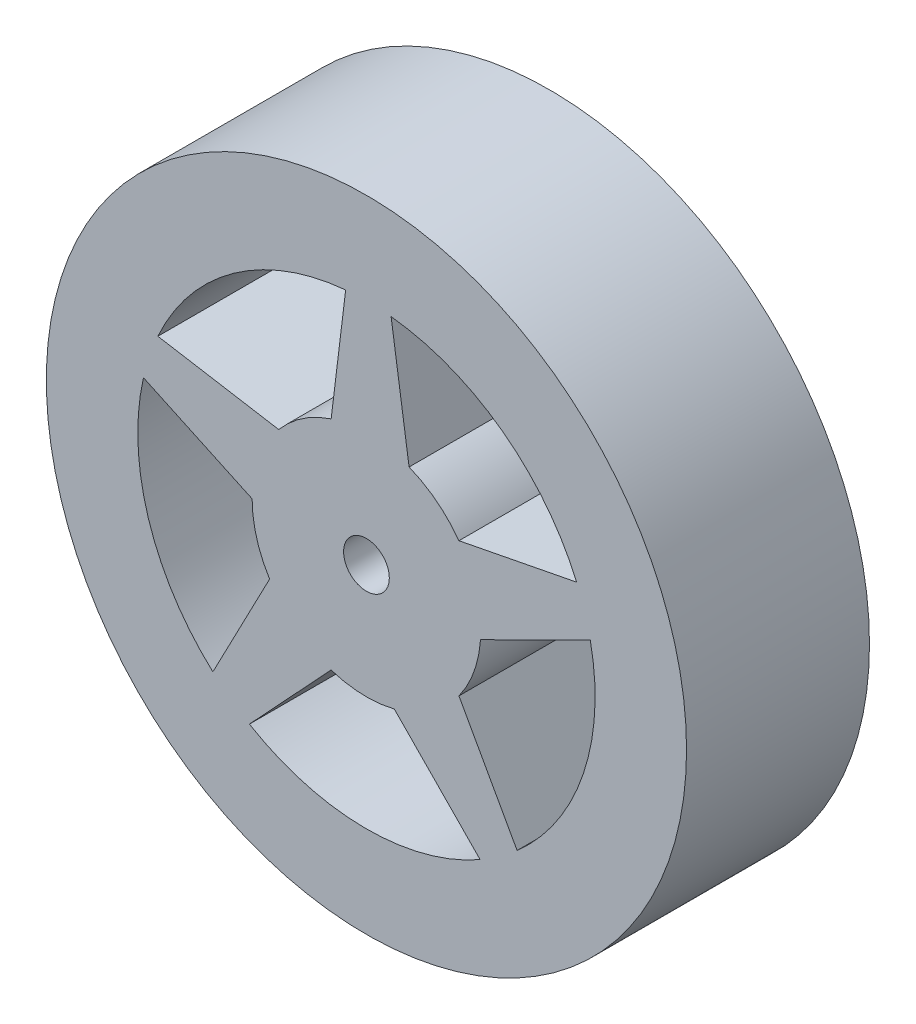
ISO-10303-21;
HEADER;
FILE_DESCRIPTION(('STEP AP214'),'2;1');
FILE_NAME('part.step','',(''),(''),'','','');
FILE_SCHEMA(('AUTOMOTIVE_DESIGN { 1 0 10303 214 1 1 1 1 }'));
ENDSEC;
DATA;
#1=APPLICATION_CONTEXT('core data for automotive mechanical design processes');
#2=APPLICATION_PROTOCOL_DEFINITION('international standard','automotive_design',2000,#1);
#3=PRODUCT_CONTEXT('',#1,'mechanical');
#4=PRODUCT('Part','Part','',(#3));
#5=PRODUCT_RELATED_PRODUCT_CATEGORY('part','',(#4));
#6=PRODUCT_DEFINITION_FORMATION('','',#4);
#7=PRODUCT_DEFINITION_CONTEXT('part definition',#1,'design');
#8=PRODUCT_DEFINITION('design','',#6,#7);
#9=PRODUCT_DEFINITION_SHAPE('','',#8);
#10=(LENGTH_UNIT() NAMED_UNIT(*) SI_UNIT(.MILLI.,.METRE.));
#11=(NAMED_UNIT(*) PLANE_ANGLE_UNIT() SI_UNIT($,.RADIAN.));
#12=(NAMED_UNIT(*) SI_UNIT($,.STERADIAN.) SOLID_ANGLE_UNIT());
#13=UNCERTAINTY_MEASURE_WITH_UNIT(LENGTH_MEASURE(1.E-05),#10,'distance_accuracy_value','');
#14=(GEOMETRIC_REPRESENTATION_CONTEXT(3) GLOBAL_UNCERTAINTY_ASSIGNED_CONTEXT((#13)) GLOBAL_UNIT_ASSIGNED_CONTEXT((#10,
#11,#12)) REPRESENTATION_CONTEXT('',''));
#15=CARTESIAN_POINT('',(0.,0.,0.));
#16=DIRECTION('',(0.,0.,1.));
#17=DIRECTION('',(1.,0.,0.));
#18=AXIS2_PLACEMENT_3D('',#15,#16,#17);
#19=CARTESIAN_POINT('',(0.,0.,-10.));
#20=DIRECTION('',(0.,0.,1.));
#21=DIRECTION('',(1.,0.,0.));
#22=AXIS2_PLACEMENT_3D('',#19,#20,#21);
#23=CYLINDRICAL_SURFACE('',#22,2.5);
#24=CARTESIAN_POINT('',(0.,0.,10.));
#25=DIRECTION('',(0.,0.,1.));
#26=DIRECTION('',(1.,0.,0.));
#27=AXIS2_PLACEMENT_3D('',#24,#25,#26);
#28=CIRCLE('',#27,2.5);
#29=CARTESIAN_POINT('',(2.5,0.,10.));
#30=VERTEX_POINT('',#29);
#31=EDGE_CURVE('E292',#30,#30,#28,.T.);
#32=ORIENTED_EDGE('',*,*,#31,.T.);
#33=EDGE_LOOP('',(#32));
#34=FACE_BOUND('',#33,.T.);
#35=CARTESIAN_POINT('',(0.,0.,0.));
#36=DIRECTION('',(0.,0.,-1.));
#37=DIRECTION('',(-1.,0.,0.));
#38=AXIS2_PLACEMENT_3D('',#35,#36,#37);
#39=CIRCLE('',#38,2.5);
#40=CARTESIAN_POINT('',(-2.5,0.,0.));
#41=VERTEX_POINT('',#40);
#42=EDGE_CURVE('E47',#41,#41,#39,.F.);
#43=ORIENTED_EDGE('',*,*,#42,.F.);
#44=EDGE_LOOP('',(#43));
#45=FACE_BOUND('',#44,.T.);
#46=ADVANCED_FACE('F43',(#34,#45),#23,.F.);
#47=CARTESIAN_POINT('',(0.,0.,10.));
#48=DIRECTION('',(0.,0.,-1.));
#49=DIRECTION('',(-1.,0.,0.));
#50=AXIS2_PLACEMENT_3D('',#47,#48,#49);
#51=CYLINDRICAL_SURFACE('',#50,25.);
#52=DIRECTION('',(0.,0.,-1.));
#53=VECTOR('',#52,1.);
#54=CARTESIAN_POINT('',(24.4708623778841,5.11633604082602,10.));
#55=LINE('',#54,#53);
#56=CARTESIAN_POINT('',(24.4708623778841,5.11633604082602,-10.));
#57=VERTEX_POINT('',#56);
#58=CARTESIAN_POINT('',(24.4708623778841,5.11633604082602,10.));
#59=VERTEX_POINT('',#58);
#60=EDGE_CURVE('E410',#57,#59,#55,.F.);
#61=ORIENTED_EDGE('',*,*,#60,.F.);
#62=CARTESIAN_POINT('',(0.,0.,-10.));
#63=DIRECTION('',(0.,0.,1.));
#64=DIRECTION('',(1.,0.,0.));
#65=AXIS2_PLACEMENT_3D('',#62,#63,#64);
#66=CIRCLE('',#65,25.);
#67=CARTESIAN_POINT('',(16.4712049980899,-18.8068978279486,-10.));
#68=VERTEX_POINT('',#67);
#69=EDGE_CURVE('E635',#68,#57,#66,.T.);
#70=ORIENTED_EDGE('',*,*,#69,.F.);
#71=DIRECTION('',(0.,0.,-1.));
#72=VECTOR('',#71,1.);
#73=CARTESIAN_POINT('',(16.4712049980899,-18.8068978279486,10.));
#74=LINE('',#73,#72);
#75=CARTESIAN_POINT('',(16.4712049980899,-18.8068978279486,10.));
#76=VERTEX_POINT('',#75);
#77=EDGE_CURVE('E68',#76,#68,#74,.T.);
#78=ORIENTED_EDGE('',*,*,#77,.F.);
#79=CARTESIAN_POINT('',(0.,0.,10.));
#80=DIRECTION('',(0.,0.,1.));
#81=DIRECTION('',(1.,0.,0.));
#82=AXIS2_PLACEMENT_3D('',#79,#80,#81);
#83=CIRCLE('',#82,25.);
#84=EDGE_CURVE('E641',#76,#59,#83,.T.);
#85=ORIENTED_EDGE('',*,*,#84,.T.);
#86=EDGE_LOOP('',(#61,#70,#78,#85));
#87=FACE_BOUND('',#86,.T.);
#88=ADVANCED_FACE('F519',(#87),#51,.F.);
#89=DIRECTION('',(0.,0.,-1.));
#90=VECTOR('',#89,1.);
#91=CARTESIAN_POINT('',(-12.7965404683244,-21.4766978849761,10.));
#92=LINE('',#91,#90);
#93=CARTESIAN_POINT('',(-12.7965404683244,-21.4766978849761,10.));
#94=VERTEX_POINT('',#93);
#95=CARTESIAN_POINT('',(-12.7965404683244,-21.4766978849761,-10.));
#96=VERTEX_POINT('',#95);
#97=EDGE_CURVE('E402',#94,#96,#92,.T.);
#98=ORIENTED_EDGE('',*,*,#97,.F.);
#99=CARTESIAN_POINT('',(12.42783707296,-21.6921383383004,10.));
#100=VERTEX_POINT('',#99);
#101=EDGE_CURVE('E498',#94,#100,#83,.T.);
#102=ORIENTED_EDGE('',*,*,#101,.T.);
#103=DIRECTION('',(0.,0.,-1.));
#104=VECTOR('',#103,1.);
#105=CARTESIAN_POINT('',(12.42783707296,-21.6921383383004,10.));
#106=LINE('',#105,#104);
#107=CARTESIAN_POINT('',(12.42783707296,-21.6921383383004,-10.));
#108=VERTEX_POINT('',#107);
#109=EDGE_CURVE('E386',#108,#100,#106,.F.);
#110=ORIENTED_EDGE('',*,*,#109,.F.);
#111=EDGE_CURVE('E595',#96,#108,#66,.T.);
#112=ORIENTED_EDGE('',*,*,#111,.F.);
#113=EDGE_LOOP('',(#98,#102,#110,#112));
#114=FACE_BOUND('',#113,.T.);
#115=ADVANCED_FACE('F525',(#114),#51,.F.);
#116=DIRECTION('',(0.,0.,-1.));
#117=VECTOR('',#116,1.);
#118=CARTESIAN_POINT('',(-16.7900366601489,-18.5228148225602,10.));
#119=LINE('',#118,#117);
#120=CARTESIAN_POINT('',(-16.7900366601489,-18.5228148225602,-10.));
#121=VERTEX_POINT('',#120);
#122=CARTESIAN_POINT('',(-16.7900366601489,-18.5228148225602,10.));
#123=VERTEX_POINT('',#122);
#124=EDGE_CURVE('E398',#121,#123,#119,.F.);
#125=ORIENTED_EDGE('',*,*,#124,.F.);
#126=CARTESIAN_POINT('',(-24.3799019459278,5.53356856892053,-10.));
#127=VERTEX_POINT('',#126);
#128=EDGE_CURVE('E457',#127,#121,#66,.T.);
#129=ORIENTED_EDGE('',*,*,#128,.F.);
#130=DIRECTION('',(0.,0.,-1.));
#131=VECTOR('',#130,1.);
#132=CARTESIAN_POINT('',(-24.3799019459278,5.53356856892053,10.));
#133=LINE('',#132,#131);
#134=CARTESIAN_POINT('',(-24.3799019459278,5.53356856892053,10.));
#135=VERTEX_POINT('',#134);
#136=EDGE_CURVE('E394',#135,#127,#133,.T.);
#137=ORIENTED_EDGE('',*,*,#136,.F.);
#138=EDGE_CURVE('E451',#135,#123,#83,.T.);
#139=ORIENTED_EDGE('',*,*,#138,.T.);
#140=EDGE_LOOP('',(#125,#129,#137,#139));
#141=FACE_BOUND('',#140,.T.);
#142=ADVANCED_FACE('F577',(#141),#51,.F.);
#143=DIRECTION('',(0.,0.,-1.));
#144=VECTOR('',#143,1.);
#145=CARTESIAN_POINT('',(-22.8046504012887,10.2444092106379,10.));
#146=LINE('',#145,#144);
#147=CARTESIAN_POINT('',(-22.8046504012887,10.2444092106379,-10.));
#148=VERTEX_POINT('',#147);
#149=CARTESIAN_POINT('',(-22.8046504012887,10.2444092106379,10.));
#150=VERTEX_POINT('',#149);
#151=EDGE_CURVE('E390',#148,#150,#146,.F.);
#152=ORIENTED_EDGE('',*,*,#151,.F.);
#153=CARTESIAN_POINT('',(-2.27106757664891,24.896631339647,-10.));
#154=VERTEX_POINT('',#153);
#155=EDGE_CURVE('E453',#154,#148,#66,.T.);
#156=ORIENTED_EDGE('',*,*,#155,.F.);
#157=DIRECTION('',(0.,0.,-1.));
#158=VECTOR('',#157,1.);
#159=CARTESIAN_POINT('',(-2.27106757664891,24.896631339647,10.));
#160=LINE('',#159,#158);
#161=CARTESIAN_POINT('',(-2.27106757664891,24.896631339647,10.));
#162=VERTEX_POINT('',#161);
#163=EDGE_CURVE('E53',#162,#154,#160,.T.);
#164=ORIENTED_EDGE('',*,*,#163,.F.);
#165=EDGE_CURVE('E447',#162,#150,#83,.T.);
#166=ORIENTED_EDGE('',*,*,#165,.T.);
#167=EDGE_LOOP('',(#152,#156,#164,#166));
#168=FACE_BOUND('',#167,.T.);
#169=ADVANCED_FACE('F475',(#168),#51,.F.);
#170=CARTESIAN_POINT('',(0.,0.,10.));
#171=DIRECTION('',(0.,0.,-1.));
#172=DIRECTION('',(-1.,0.,0.));
#173=AXIS2_PLACEMENT_3D('',#170,#171,#172);
#174=CYLINDRICAL_SURFACE('',#173,12.5);
#175=CARTESIAN_POINT('',(0.,0.,-10.));
#176=DIRECTION('',(0.,0.,1.));
#177=DIRECTION('',(1.,0.,0.));
#178=AXIS2_PLACEMENT_3D('',#175,#176,#177);
#179=CIRCLE('',#178,12.5);
#180=CARTESIAN_POINT('',(10.1106359392021,-7.35017284864209,-10.));
#181=VERTEX_POINT('',#180);
#182=CARTESIAN_POINT('',(12.4710442423428,-0.850326705171322,-10.));
#183=VERTEX_POINT('',#182);
#184=EDGE_CURVE('E606',#181,#183,#179,.T.);
#185=ORIENTED_EDGE('',*,*,#184,.T.);
#186=DIRECTION('',(0.,0.,-1.));
#187=VECTOR('',#186,1.);
#188=CARTESIAN_POINT('',(12.4710442423428,-0.85032670517132,10.));
#189=LINE('',#188,#187);
#190=CARTESIAN_POINT('',(12.4710442423428,-0.850326705171322,10.));
#191=VERTEX_POINT('',#190);
#192=EDGE_CURVE('E380',#191,#183,#189,.T.);
#193=ORIENTED_EDGE('',*,*,#192,.F.);
#194=CARTESIAN_POINT('',(0.,0.,10.));
#195=DIRECTION('',(0.,0.,1.));
#196=DIRECTION('',(1.,0.,0.));
#197=AXIS2_PLACEMENT_3D('',#194,#195,#196);
#198=CIRCLE('',#197,12.5);
#199=CARTESIAN_POINT('',(10.1106359392021,-7.35017284864209,10.));
#200=VERTEX_POINT('',#199);
#201=EDGE_CURVE('E624',#200,#191,#198,.T.);
#202=ORIENTED_EDGE('',*,*,#201,.F.);
#203=DIRECTION('',(0.,0.,-1.));
#204=VECTOR('',#203,1.);
#205=CARTESIAN_POINT('',(10.1106359392021,-7.35017284864209,10.));
#206=LINE('',#205,#204);
#207=EDGE_CURVE('E349',#200,#181,#206,.T.);
#208=ORIENTED_EDGE('',*,*,#207,.T.);
#209=EDGE_LOOP('',(#185,#193,#202,#208));
#210=FACE_BOUND('',#209,.T.);
#211=ADVANCED_FACE('F570',(#210),#174,.T.);
#212=CARTESIAN_POINT('',(-3.86607145444526,-11.8871145156898,10.));
#213=VERTEX_POINT('',#212);
#214=CARTESIAN_POINT('',(3.04505585455277,-12.1234332943541,10.));
#215=VERTEX_POINT('',#214);
#216=EDGE_CURVE('E626',#213,#215,#198,.T.);
#217=ORIENTED_EDGE('',*,*,#216,.F.);
#218=DIRECTION('',(0.,0.,-1.));
#219=VECTOR('',#218,1.);
#220=CARTESIAN_POINT('',(-3.86607145444526,-11.8871145156898,10.));
#221=LINE('',#220,#219);
#222=CARTESIAN_POINT('',(-3.86607145444526,-11.8871145156898,-10.));
#223=VERTEX_POINT('',#222);
#224=EDGE_CURVE('E327',#213,#223,#221,.T.);
#225=ORIENTED_EDGE('',*,*,#224,.T.);
#226=CARTESIAN_POINT('',(3.04505585455277,-12.1234332943541,-10.));
#227=VERTEX_POINT('',#226);
#228=EDGE_CURVE('E603',#223,#227,#179,.T.);
#229=ORIENTED_EDGE('',*,*,#228,.T.);
#230=DIRECTION('',(0.,0.,-1.));
#231=VECTOR('',#230,1.);
#232=CARTESIAN_POINT('',(3.04505585455277,-12.1234332943541,10.));
#233=LINE('',#232,#231);
#234=EDGE_CURVE('E358',#215,#227,#233,.T.);
#235=ORIENTED_EDGE('',*,*,#234,.F.);
#236=EDGE_LOOP('',(#217,#225,#229,#235));
#237=FACE_BOUND('',#236,.T.);
#238=ADVANCED_FACE('F582',(#237),#174,.T.);
#239=CARTESIAN_POINT('',(-12.499999500985,0.00353204978360225,-10.));
#240=VERTEX_POINT('',#239);
#241=CARTESIAN_POINT('',(-10.5890962265874,-6.64236713108156,-10.));
#242=VERTEX_POINT('',#241);
#243=EDGE_CURVE('E433',#240,#242,#179,.T.);
#244=ORIENTED_EDGE('',*,*,#243,.T.);
#245=DIRECTION('',(0.,0.,-1.));
#246=VECTOR('',#245,1.);
#247=CARTESIAN_POINT('',(-10.5890962265874,-6.64236713108157,10.));
#248=LINE('',#247,#246);
#249=CARTESIAN_POINT('',(-10.5890962265874,-6.64236713108156,10.));
#250=VERTEX_POINT('',#249);
#251=EDGE_CURVE('E336',#250,#242,#248,.T.);
#252=ORIENTED_EDGE('',*,*,#251,.F.);
#253=CARTESIAN_POINT('',(-12.499999500985,0.00353204978360052,10.));
#254=VERTEX_POINT('',#253);
#255=EDGE_CURVE('E419',#254,#250,#198,.T.);
#256=ORIENTED_EDGE('',*,*,#255,.F.);
#257=DIRECTION('',(0.,0.,-1.));
#258=VECTOR('',#257,1.);
#259=CARTESIAN_POINT('',(-12.499999500985,0.00353204978360225,10.));
#260=LINE('',#259,#258);
#261=EDGE_CURVE('E305',#254,#240,#260,.T.);
#262=ORIENTED_EDGE('',*,*,#261,.T.);
#263=EDGE_LOOP('',(#244,#252,#256,#262));
#264=FACE_BOUND('',#263,.T.);
#265=ADVANCED_FACE('F601',(#264),#174,.T.);
#266=CARTESIAN_POINT('',(-3.85935309652028,11.889297442506,-10.));
#267=VERTEX_POINT('',#266);
#268=CARTESIAN_POINT('',(-9.58947723272698,8.01822464159062,-10.));
#269=VERTEX_POINT('',#268);
#270=EDGE_CURVE('E428',#267,#269,#179,.T.);
#271=ORIENTED_EDGE('',*,*,#270,.T.);
#272=DIRECTION('',(0.,0.,-1.));
#273=VECTOR('',#272,1.);
#274=CARTESIAN_POINT('',(-9.58947723272698,8.01822464159062,10.));
#275=LINE('',#274,#273);
#276=CARTESIAN_POINT('',(-9.58947723272698,8.01822464159062,10.));
#277=VERTEX_POINT('',#276);
#278=EDGE_CURVE('E314',#277,#269,#275,.T.);
#279=ORIENTED_EDGE('',*,*,#278,.F.);
#280=CARTESIAN_POINT('',(-3.85935309652028,11.889297442506,10.));
#281=VERTEX_POINT('',#280);
#282=EDGE_CURVE('E414',#281,#277,#198,.T.);
#283=ORIENTED_EDGE('',*,*,#282,.F.);
#284=DIRECTION('',(0.,0.,-1.));
#285=VECTOR('',#284,1.);
#286=CARTESIAN_POINT('',(-3.85935309652028,11.889297442506,10.));
#287=LINE('',#286,#285);
#288=EDGE_CURVE('E427',#281,#267,#287,.T.);
#289=ORIENTED_EDGE('',*,*,#288,.T.);
#290=EDGE_LOOP('',(#271,#279,#283,#289));
#291=FACE_BOUND('',#290,.T.);
#292=ADVANCED_FACE('F487',(#291),#174,.T.);
#293=CARTESIAN_POINT('',(0.,0.,10.));
#294=DIRECTION('',(0.,0.,1.));
#295=DIRECTION('',(1.,0.,0.));
#296=AXIS2_PLACEMENT_3D('',#293,#294,#295);
#297=PLANE('',#296);
#298=ORIENTED_EDGE('',*,*,#31,.F.);
#299=EDGE_LOOP('',(#298));
#300=FACE_BOUND('',#299,.T.);
#301=CARTESIAN_POINT('',(10.1147881127483,7.34445787204241,10.));
#302=VERTEX_POINT('',#301);
#303=CARTESIAN_POINT('',(4.66247336241872,11.5979024890165,10.));
#304=VERTEX_POINT('',#303);
#305=EDGE_CURVE('E420',#302,#304,#198,.T.);
#306=ORIENTED_EDGE('',*,*,#305,.T.);
#307=DIRECTION('',(0.146737673225105,-0.989175442101391,0.));
#308=VECTOR('',#307,1.);
#309=CARTESIAN_POINT('',(6.24550870366448,0.92648015334466,10.));
#310=LINE('',#309,#308);
#311=CARTESIAN_POINT('',(2.69598761059333,24.8542079093969,10.));
#312=VERTEX_POINT('',#311);
#313=EDGE_CURVE('E418',#312,#304,#310,.T.);
#314=ORIENTED_EDGE('',*,*,#313,.F.);
#315=CARTESIAN_POINT('',(22.976304992811,9.85339580435737,10.));
#316=VERTEX_POINT('',#315);
#317=EDGE_CURVE('E452',#316,#312,#83,.T.);
#318=ORIENTED_EDGE('',*,*,#317,.F.);
#319=DIRECTION('',(0.981499575248451,0.191464314657094,0.));
#320=VECTOR('',#319,1.);
#321=CARTESIAN_POINT('',(-1.00939245872167,5.17442778446024,10.));
#322=LINE('',#321,#320);
#323=EDGE_CURVE('E367',#302,#316,#322,.T.);
#324=ORIENTED_EDGE('',*,*,#323,.F.);
#325=EDGE_LOOP('',(#306,#314,#318,#324));
#326=FACE_BOUND('',#325,.T.);
#327=DIRECTION('',(0.121206664630946,0.992627293826359,0.));
#328=VECTOR('',#327,1.);
#329=CARTESIAN_POINT('',(-5.23309268624852,0.638996846197679,10.));
#330=LINE('',#329,#328);
#331=EDGE_CURVE('E424',#281,#162,#330,.T.);
#332=ORIENTED_EDGE('',*,*,#331,.F.);
#333=ORIENTED_EDGE('',*,*,#282,.T.);
#334=DIRECTION('',(0.986106184711261,-0.166116201720968,0.));
#335=VECTOR('',#334,1.);
#336=CARTESIAN_POINT('',(1.04883334089247,6.2261298625328,10.));
#337=LINE('',#336,#335);
#338=EDGE_CURVE('E297',#150,#277,#337,.T.);
#339=ORIENTED_EDGE('',*,*,#338,.F.);
#340=ORIENTED_EDGE('',*,*,#165,.F.);
#341=EDGE_LOOP('',(#332,#333,#339,#340));
#342=FACE_BOUND('',#341,.T.);
#343=ORIENTED_EDGE('',*,*,#101,.F.);
#344=DIRECTION('',(-0.681509935852068,-0.731808859836303,0.));
#345=VECTOR('',#344,1.);
#346=CARTESIAN_POINT('',(3.85806799385786,-3.59289401278243,10.));
#347=LINE('',#346,#345);
#348=EDGE_CURVE('E322',#213,#94,#347,.T.);
#349=ORIENTED_EDGE('',*,*,#348,.F.);
#350=ORIENTED_EDGE('',*,*,#216,.T.);
#351=DIRECTION('',(-0.700136008151229,0.714009502800952,0.));
#352=VECTOR('',#351,1.);
#353=CARTESIAN_POINT('',(-4.50815130910358,-4.42055609808518,10.));
#354=LINE('',#353,#352);
#355=EDGE_CURVE('E341',#100,#215,#354,.T.);
#356=ORIENTED_EDGE('',*,*,#355,.F.);
#357=EDGE_LOOP('',(#343,#349,#350,#356));
#358=FACE_BOUND('',#357,.T.);
#359=ORIENTED_EDGE('',*,*,#138,.F.);
#360=DIRECTION('',(-0.906589736843511,0.422013091088432,0.));
#361=VECTOR('',#360,1.);
#362=CARTESIAN_POINT('',(-2.22483668765845,-4.77950601480606,10.));
#363=LINE('',#362,#361);
#364=EDGE_CURVE('E300',#254,#135,#363,.T.);
#365=ORIENTED_EDGE('',*,*,#364,.F.);
#366=ORIENTED_EDGE('',*,*,#255,.T.);
#367=DIRECTION('',(0.462709465442945,0.886509983355802,0.));
#368=VECTOR('',#367,1.);
#369=CARTESIAN_POINT('',(-5.59729405045885,2.92147972007138,10.));
#370=LINE('',#369,#368);
#371=EDGE_CURVE('E319',#123,#250,#370,.T.);
#372=ORIENTED_EDGE('',*,*,#371,.F.);
#373=EDGE_LOOP('',(#359,#365,#366,#372));
#374=FACE_BOUND('',#373,.T.);
#375=DIRECTION('',(-0.895417315228074,-0.445227842334404,0.));
#376=VECTOR('',#375,1.);
#377=CARTESIAN_POINT('',(2.81110331500553,-5.6535336378636,10.));
#378=LINE('',#377,#376);
#379=EDGE_CURVE('E363',#59,#191,#378,.T.);
#380=ORIENTED_EDGE('',*,*,#379,.F.);
#381=ORIENTED_EDGE('',*,*,#84,.F.);
#382=DIRECTION('',(0.485393432816176,-0.874295839735572,0.));
#383=VECTOR('',#382,1.);
#384=CARTESIAN_POINT('',(4.60925383877071,2.55897539693054,10.));
#385=LINE('',#384,#383);
#386=EDGE_CURVE('E344',#200,#76,#385,.T.);
#387=ORIENTED_EDGE('',*,*,#386,.F.);
#388=ORIENTED_EDGE('',*,*,#201,.T.);
#389=EDGE_LOOP('',(#380,#381,#387,#388));
#390=FACE_BOUND('',#389,.T.);
#391=CARTESIAN_POINT('',(0.,0.,10.));
#392=DIRECTION('',(0.,0.,1.));
#393=DIRECTION('',(1.,0.,0.));
#394=AXIS2_PLACEMENT_3D('',#391,#392,#393);
#395=CIRCLE('',#394,35.);
#396=CARTESIAN_POINT('',(35.,0.,10.));
#397=VERTEX_POINT('',#396);
#398=EDGE_CURVE('E458',#397,#397,#395,.T.);
#399=ORIENTED_EDGE('',*,*,#398,.T.);
#400=EDGE_LOOP('',(#399));
#401=FACE_BOUND('',#400,.T.);
#402=ADVANCED_FACE('F489',(#300,#326,#342,#358,#374,#390,#401),#297,.T.);
#403=CARTESIAN_POINT('',(0.,0.,-10.));
#404=DIRECTION('',(0.,0.,1.));
#405=DIRECTION('',(1.,0.,0.));
#406=AXIS2_PLACEMENT_3D('',#403,#404,#405);
#407=PLANE('',#406);
#408=DIRECTION('',(0.866025403784439,-0.5,0.));
#409=VECTOR('',#408,1.);
#410=CARTESIAN_POINT('',(0.,8.,-10.));
#411=LINE('',#410,#409);
#412=CARTESIAN_POINT('',(0.,8.,-10.));
#413=VERTEX_POINT('',#412);
#414=CARTESIAN_POINT('',(6.92820323027551,4.,-10.));
#415=VERTEX_POINT('',#414);
#416=EDGE_CURVE('E264',#413,#415,#411,.T.);
#417=ORIENTED_EDGE('',*,*,#416,.F.);
#418=DIRECTION('',(0.866025403784439,0.5,0.));
#419=VECTOR('',#418,1.);
#420=CARTESIAN_POINT('',(-6.92820323027551,4.00000000000001,-10.));
#421=LINE('',#420,#419);
#422=CARTESIAN_POINT('',(-6.92820323027551,4.00000000000001,-10.));
#423=VERTEX_POINT('',#422);
#424=EDGE_CURVE('E60',#423,#413,#421,.T.);
#425=ORIENTED_EDGE('',*,*,#424,.F.);
#426=DIRECTION('',(0.,1.,0.));
#427=VECTOR('',#426,1.);
#428=CARTESIAN_POINT('',(-6.92820323027551,-4.,-10.));
#429=LINE('',#428,#427);
#430=CARTESIAN_POINT('',(-6.92820323027551,-4.,-10.));
#431=VERTEX_POINT('',#430);
#432=EDGE_CURVE('E244',#431,#423,#429,.T.);
#433=ORIENTED_EDGE('',*,*,#432,.F.);
#434=DIRECTION('',(-0.866025403784439,0.5,0.));
#435=VECTOR('',#434,1.);
#436=CARTESIAN_POINT('',(0.,-8.,-10.));
#437=LINE('',#436,#435);
#438=CARTESIAN_POINT('',(0.,-8.,-10.));
#439=VERTEX_POINT('',#438);
#440=EDGE_CURVE('E248',#439,#431,#437,.T.);
#441=ORIENTED_EDGE('',*,*,#440,.F.);
#442=DIRECTION('',(-0.866025403784439,-0.5,0.));
#443=VECTOR('',#442,1.);
#444=CARTESIAN_POINT('',(6.92820323027551,-4.,-10.));
#445=LINE('',#444,#443);
#446=CARTESIAN_POINT('',(6.92820323027551,-4.,-10.));
#447=VERTEX_POINT('',#446);
#448=EDGE_CURVE('E271',#447,#439,#445,.T.);
#449=ORIENTED_EDGE('',*,*,#448,.F.);
#450=DIRECTION('',(0.,-1.,0.));
#451=VECTOR('',#450,1.);
#452=CARTESIAN_POINT('',(6.92820323027551,4.,-10.));
#453=LINE('',#452,#451);
#454=EDGE_CURVE('E267',#415,#447,#453,.T.);
#455=ORIENTED_EDGE('',*,*,#454,.F.);
#456=EDGE_LOOP('',(#417,#425,#433,#441,#449,#455));
#457=FACE_BOUND('',#456,.T.);
#458=DIRECTION('',(0.146737673225105,-0.989175442101391,0.));
#459=VECTOR('',#458,1.);
#460=CARTESIAN_POINT('',(6.24550870366448,0.92648015334466,-10.));
#461=LINE('',#460,#459);
#462=CARTESIAN_POINT('',(2.69598761059333,24.8542079093969,-10.));
#463=VERTEX_POINT('',#462);
#464=CARTESIAN_POINT('',(4.66247336241872,11.5979024890165,-10.));
#465=VERTEX_POINT('',#464);
#466=EDGE_CURVE('E432',#463,#465,#461,.T.);
#467=ORIENTED_EDGE('',*,*,#466,.T.);
#468=CARTESIAN_POINT('',(10.1147881127483,7.34445787204241,-10.));
#469=VERTEX_POINT('',#468);
#470=EDGE_CURVE('E413',#469,#465,#179,.T.);
#471=ORIENTED_EDGE('',*,*,#470,.F.);
#472=DIRECTION('',(0.981499575248451,0.191464314657094,0.));
#473=VECTOR('',#472,1.);
#474=CARTESIAN_POINT('',(-1.00939245872167,5.17442778446024,-10.));
#475=LINE('',#474,#473);
#476=CARTESIAN_POINT('',(22.976304992811,9.85339580435736,-10.));
#477=VERTEX_POINT('',#476);
#478=EDGE_CURVE('E368',#469,#477,#475,.T.);
#479=ORIENTED_EDGE('',*,*,#478,.T.);
#480=EDGE_CURVE('E446',#477,#463,#66,.T.);
#481=ORIENTED_EDGE('',*,*,#480,.T.);
#482=EDGE_LOOP('',(#467,#471,#479,#481));
#483=FACE_BOUND('',#482,.T.);
#484=ORIENTED_EDGE('',*,*,#270,.F.);
#485=DIRECTION('',(0.121206664630946,0.992627293826359,0.));
#486=VECTOR('',#485,1.);
#487=CARTESIAN_POINT('',(-5.23309268624852,0.638996846197679,-10.));
#488=LINE('',#487,#486);
#489=EDGE_CURVE('E437',#267,#154,#488,.T.);
#490=ORIENTED_EDGE('',*,*,#489,.T.);
#491=ORIENTED_EDGE('',*,*,#155,.T.);
#492=DIRECTION('',(0.986106184711261,-0.166116201720968,0.));
#493=VECTOR('',#492,1.);
#494=CARTESIAN_POINT('',(1.04883334089247,6.2261298625328,-10.));
#495=LINE('',#494,#493);
#496=EDGE_CURVE('E296',#148,#269,#495,.T.);
#497=ORIENTED_EDGE('',*,*,#496,.T.);
#498=EDGE_LOOP('',(#484,#490,#491,#497));
#499=FACE_BOUND('',#498,.T.);
#500=DIRECTION('',(-0.681509935852068,-0.731808859836303,0.));
#501=VECTOR('',#500,1.);
#502=CARTESIAN_POINT('',(3.85806799385786,-3.59289401278243,-10.));
#503=LINE('',#502,#501);
#504=EDGE_CURVE('E323',#223,#96,#503,.T.);
#505=ORIENTED_EDGE('',*,*,#504,.T.);
#506=ORIENTED_EDGE('',*,*,#111,.T.);
#507=DIRECTION('',(-0.700136008151229,0.714009502800952,0.));
#508=VECTOR('',#507,1.);
#509=CARTESIAN_POINT('',(-4.50815130910358,-4.42055609808518,-10.));
#510=LINE('',#509,#508);
#511=EDGE_CURVE('E340',#108,#227,#510,.T.);
#512=ORIENTED_EDGE('',*,*,#511,.T.);
#513=ORIENTED_EDGE('',*,*,#228,.F.);
#514=EDGE_LOOP('',(#505,#506,#512,#513));
#515=FACE_BOUND('',#514,.T.);
#516=DIRECTION('',(-0.906589736843511,0.422013091088432,0.));
#517=VECTOR('',#516,1.);
#518=CARTESIAN_POINT('',(-2.22483668765845,-4.77950601480606,-10.));
#519=LINE('',#518,#517);
#520=EDGE_CURVE('E301',#240,#127,#519,.T.);
#521=ORIENTED_EDGE('',*,*,#520,.T.);
#522=ORIENTED_EDGE('',*,*,#128,.T.);
#523=DIRECTION('',(0.462709465442945,0.886509983355802,0.));
#524=VECTOR('',#523,1.);
#525=CARTESIAN_POINT('',(-5.59729405045885,2.92147972007138,-10.));
#526=LINE('',#525,#524);
#527=EDGE_CURVE('E318',#121,#242,#526,.T.);
#528=ORIENTED_EDGE('',*,*,#527,.T.);
#529=ORIENTED_EDGE('',*,*,#243,.F.);
#530=EDGE_LOOP('',(#521,#522,#528,#529));
#531=FACE_BOUND('',#530,.T.);
#532=ORIENTED_EDGE('',*,*,#69,.T.);
#533=DIRECTION('',(-0.895417315228074,-0.445227842334404,0.));
#534=VECTOR('',#533,1.);
#535=CARTESIAN_POINT('',(2.81110331500553,-5.6535336378636,-10.));
#536=LINE('',#535,#534);
#537=EDGE_CURVE('E362',#57,#183,#536,.T.);
#538=ORIENTED_EDGE('',*,*,#537,.T.);
#539=ORIENTED_EDGE('',*,*,#184,.F.);
#540=DIRECTION('',(0.485393432816176,-0.874295839735572,0.));
#541=VECTOR('',#540,1.);
#542=CARTESIAN_POINT('',(4.60925383877071,2.55897539693054,-10.));
#543=LINE('',#542,#541);
#544=EDGE_CURVE('E345',#181,#68,#543,.T.);
#545=ORIENTED_EDGE('',*,*,#544,.T.);
#546=EDGE_LOOP('',(#532,#538,#539,#545));
#547=FACE_BOUND('',#546,.T.);
#548=CARTESIAN_POINT('',(0.,0.,-10.));
#549=DIRECTION('',(0.,0.,1.));
#550=DIRECTION('',(1.,0.,0.));
#551=AXIS2_PLACEMENT_3D('',#548,#549,#550);
#552=CIRCLE('',#551,35.);
#553=CARTESIAN_POINT('',(35.,0.,-10.));
#554=VERTEX_POINT('',#553);
#555=EDGE_CURVE('E450',#554,#554,#552,.T.);
#556=ORIENTED_EDGE('',*,*,#555,.F.);
#557=EDGE_LOOP('',(#556));
#558=FACE_BOUND('',#557,.T.);
#559=ADVANCED_FACE('F479',(#457,#483,#499,#515,#531,#547,#558),#407,.F.);
#560=CARTESIAN_POINT('',(0.,0.,10.));
#561=DIRECTION('',(0.,0.,-1.));
#562=DIRECTION('',(-1.,0.,0.));
#563=AXIS2_PLACEMENT_3D('',#560,#561,#562);
#564=CYLINDRICAL_SURFACE('',#563,35.);
#565=ORIENTED_EDGE('',*,*,#398,.F.);
#566=EDGE_LOOP('',(#565));
#567=FACE_BOUND('',#566,.T.);
#568=ORIENTED_EDGE('',*,*,#555,.T.);
#569=EDGE_LOOP('',(#568));
#570=FACE_BOUND('',#569,.T.);
#571=ADVANCED_FACE('F45',(#567,#570),#564,.T.);
#572=DIRECTION('',(0.,0.,-1.));
#573=VECTOR('',#572,1.);
#574=CARTESIAN_POINT('',(22.976304992811,9.85339580435736,10.));
#575=LINE('',#574,#573);
#576=EDGE_CURVE('E406',#316,#477,#575,.T.);
#577=ORIENTED_EDGE('',*,*,#576,.F.);
#578=ORIENTED_EDGE('',*,*,#317,.T.);
#579=DIRECTION('',(0.,0.,-1.));
#580=VECTOR('',#579,1.);
#581=CARTESIAN_POINT('',(2.69598761059333,24.8542079093969,10.));
#582=LINE('',#581,#580);
#583=EDGE_CURVE('E11',#463,#312,#582,.F.);
#584=ORIENTED_EDGE('',*,*,#583,.F.);
#585=ORIENTED_EDGE('',*,*,#480,.F.);
#586=EDGE_LOOP('',(#577,#578,#584,#585));
#587=FACE_BOUND('',#586,.T.);
#588=ADVANCED_FACE('F510',(#587),#51,.F.);
#589=ORIENTED_EDGE('',*,*,#305,.F.);
#590=DIRECTION('',(0.,0.,-1.));
#591=VECTOR('',#590,1.);
#592=CARTESIAN_POINT('',(10.1147881127483,7.34445787204241,10.));
#593=LINE('',#592,#591);
#594=EDGE_CURVE('E371',#302,#469,#593,.T.);
#595=ORIENTED_EDGE('',*,*,#594,.T.);
#596=ORIENTED_EDGE('',*,*,#470,.T.);
#597=DIRECTION('',(0.,0.,-1.));
#598=VECTOR('',#597,1.);
#599=CARTESIAN_POINT('',(4.66247336241872,11.5979024890165,10.));
#600=LINE('',#599,#598);
#601=EDGE_CURVE('E442',#304,#465,#600,.T.);
#602=ORIENTED_EDGE('',*,*,#601,.F.);
#603=EDGE_LOOP('',(#589,#595,#596,#602));
#604=FACE_BOUND('',#603,.T.);
#605=ADVANCED_FACE('F566',(#604),#174,.T.);
#606=CARTESIAN_POINT('',(6.24550870366448,0.92648015334466,10.));
#607=DIRECTION('',(0.989175442101391,0.146737673225105,0.));
#608=DIRECTION('',(-0.146737673225105,0.989175442101391,0.));
#609=AXIS2_PLACEMENT_3D('',#606,#607,#608);
#610=PLANE('',#609);
#611=ORIENTED_EDGE('',*,*,#466,.F.);
#612=ORIENTED_EDGE('',*,*,#583,.T.);
#613=ORIENTED_EDGE('',*,*,#313,.T.);
#614=ORIENTED_EDGE('',*,*,#601,.T.);
#615=EDGE_LOOP('',(#611,#612,#613,#614));
#616=FACE_BOUND('',#615,.T.);
#617=ADVANCED_FACE('F563',(#616),#610,.T.);
#618=CARTESIAN_POINT('',(-5.23309268624852,0.638996846197679,10.));
#619=DIRECTION('',(-0.992627293826359,0.121206664630946,0.));
#620=DIRECTION('',(-0.121206664630946,-0.992627293826359,0.));
#621=AXIS2_PLACEMENT_3D('',#618,#619,#620);
#622=PLANE('',#621);
#623=ORIENTED_EDGE('',*,*,#331,.T.);
#624=ORIENTED_EDGE('',*,*,#163,.T.);
#625=ORIENTED_EDGE('',*,*,#489,.F.);
#626=ORIENTED_EDGE('',*,*,#288,.F.);
#627=EDGE_LOOP('',(#623,#624,#625,#626));
#628=FACE_BOUND('',#627,.T.);
#629=ADVANCED_FACE('F471',(#628),#622,.T.);
#630=CARTESIAN_POINT('',(4.60925383877071,2.55897539693054,10.));
#631=DIRECTION('',(0.874295839735572,0.485393432816176,0.));
#632=DIRECTION('',(-0.485393432816176,0.874295839735571,0.));
#633=AXIS2_PLACEMENT_3D('',#630,#631,#632);
#634=PLANE('',#633);
#635=ORIENTED_EDGE('',*,*,#386,.T.);
#636=ORIENTED_EDGE('',*,*,#77,.T.);
#637=ORIENTED_EDGE('',*,*,#544,.F.);
#638=ORIENTED_EDGE('',*,*,#207,.F.);
#639=EDGE_LOOP('',(#635,#636,#637,#638));
#640=FACE_BOUND('',#639,.T.);
#641=ADVANCED_FACE('F547',(#640),#634,.T.);
#642=CARTESIAN_POINT('',(-4.50815130910358,-4.42055609808518,10.));
#643=DIRECTION('',(-0.714009502800952,-0.700136008151228,0.));
#644=DIRECTION('',(0.700136008151229,-0.714009502800952,0.));
#645=AXIS2_PLACEMENT_3D('',#642,#643,#644);
#646=PLANE('',#645);
#647=ORIENTED_EDGE('',*,*,#511,.F.);
#648=ORIENTED_EDGE('',*,*,#109,.T.);
#649=ORIENTED_EDGE('',*,*,#355,.T.);
#650=ORIENTED_EDGE('',*,*,#234,.T.);
#651=EDGE_LOOP('',(#647,#648,#649,#650));
#652=FACE_BOUND('',#651,.T.);
#653=ADVANCED_FACE('F534',(#652),#646,.T.);
#654=CARTESIAN_POINT('',(-2.22483668765845,-4.77950601480606,10.));
#655=DIRECTION('',(-0.422013091088432,-0.906589736843511,0.));
#656=DIRECTION('',(0.906589736843511,-0.422013091088432,0.));
#657=AXIS2_PLACEMENT_3D('',#654,#655,#656);
#658=PLANE('',#657);
#659=ORIENTED_EDGE('',*,*,#364,.T.);
#660=ORIENTED_EDGE('',*,*,#136,.T.);
#661=ORIENTED_EDGE('',*,*,#520,.F.);
#662=ORIENTED_EDGE('',*,*,#261,.F.);
#663=EDGE_LOOP('',(#659,#660,#661,#662));
#664=FACE_BOUND('',#663,.T.);
#665=ADVANCED_FACE('F531',(#664),#658,.T.);
#666=CARTESIAN_POINT('',(1.04883334089247,6.2261298625328,10.));
#667=DIRECTION('',(0.166116201720968,0.986106184711261,0.));
#668=DIRECTION('',(-0.986106184711261,0.166116201720968,0.));
#669=AXIS2_PLACEMENT_3D('',#666,#667,#668);
#670=PLANE('',#669);
#671=ORIENTED_EDGE('',*,*,#496,.F.);
#672=ORIENTED_EDGE('',*,*,#151,.T.);
#673=ORIENTED_EDGE('',*,*,#338,.T.);
#674=ORIENTED_EDGE('',*,*,#278,.T.);
#675=EDGE_LOOP('',(#671,#672,#673,#674));
#676=FACE_BOUND('',#675,.T.);
#677=ADVANCED_FACE('F482',(#676),#670,.T.);
#678=CARTESIAN_POINT('',(3.85806799385786,-3.59289401278243,10.));
#679=DIRECTION('',(0.731808859836303,-0.681509935852068,0.));
#680=DIRECTION('',(0.681509935852068,0.731808859836303,0.));
#681=AXIS2_PLACEMENT_3D('',#678,#679,#680);
#682=PLANE('',#681);
#683=ORIENTED_EDGE('',*,*,#348,.T.);
#684=ORIENTED_EDGE('',*,*,#97,.T.);
#685=ORIENTED_EDGE('',*,*,#504,.F.);
#686=ORIENTED_EDGE('',*,*,#224,.F.);
#687=EDGE_LOOP('',(#683,#684,#685,#686));
#688=FACE_BOUND('',#687,.T.);
#689=ADVANCED_FACE('F538',(#688),#682,.T.);
#690=CARTESIAN_POINT('',(-5.59729405045885,2.92147972007138,10.));
#691=DIRECTION('',(-0.886509983355802,0.462709465442945,0.));
#692=DIRECTION('',(-0.462709465442945,-0.886509983355802,0.));
#693=AXIS2_PLACEMENT_3D('',#690,#691,#692);
#694=PLANE('',#693);
#695=ORIENTED_EDGE('',*,*,#527,.F.);
#696=ORIENTED_EDGE('',*,*,#124,.T.);
#697=ORIENTED_EDGE('',*,*,#371,.T.);
#698=ORIENTED_EDGE('',*,*,#251,.T.);
#699=EDGE_LOOP('',(#695,#696,#697,#698));
#700=FACE_BOUND('',#699,.T.);
#701=ADVANCED_FACE('F541',(#700),#694,.T.);
#702=CARTESIAN_POINT('',(2.81110331500553,-5.6535336378636,10.));
#703=DIRECTION('',(0.445227842334404,-0.895417315228073,0.));
#704=DIRECTION('',(0.895417315228073,0.445227842334404,0.));
#705=AXIS2_PLACEMENT_3D('',#702,#703,#704);
#706=PLANE('',#705);
#707=ORIENTED_EDGE('',*,*,#537,.F.);
#708=ORIENTED_EDGE('',*,*,#60,.T.);
#709=ORIENTED_EDGE('',*,*,#379,.T.);
#710=ORIENTED_EDGE('',*,*,#192,.T.);
#711=EDGE_LOOP('',(#707,#708,#709,#710));
#712=FACE_BOUND('',#711,.T.);
#713=ADVANCED_FACE('F545',(#712),#706,.T.);
#714=CARTESIAN_POINT('',(-1.00939245872167,5.17442778446024,10.));
#715=DIRECTION('',(-0.191464314657094,0.981499575248451,0.));
#716=DIRECTION('',(-0.981499575248451,-0.191464314657094,0.));
#717=AXIS2_PLACEMENT_3D('',#714,#715,#716);
#718=PLANE('',#717);
#719=ORIENTED_EDGE('',*,*,#323,.T.);
#720=ORIENTED_EDGE('',*,*,#576,.T.);
#721=ORIENTED_EDGE('',*,*,#478,.F.);
#722=ORIENTED_EDGE('',*,*,#594,.F.);
#723=EDGE_LOOP('',(#719,#720,#721,#722));
#724=FACE_BOUND('',#723,.T.);
#725=ADVANCED_FACE('F554',(#724),#718,.T.);
#726=CARTESIAN_POINT('',(0.,0.,0.));
#727=DIRECTION('',(0.,0.,-1.));
#728=DIRECTION('',(-1.,0.,0.));
#729=AXIS2_PLACEMENT_3D('',#726,#727,#728);
#730=PLANE('',#729);
#731=DIRECTION('',(0.866025403784439,0.5,0.));
#732=VECTOR('',#731,1.);
#733=CARTESIAN_POINT('',(-6.92820323027551,4.00000000000001,0.));
#734=LINE('',#733,#732);
#735=CARTESIAN_POINT('',(-6.92820323027551,4.00000000000001,0.));
#736=VERTEX_POINT('',#735);
#737=CARTESIAN_POINT('',(0.,8.,0.));
#738=VERTEX_POINT('',#737);
#739=EDGE_CURVE('E221',#736,#738,#734,.T.);
#740=ORIENTED_EDGE('',*,*,#739,.T.);
#741=DIRECTION('',(0.866025403784439,-0.5,0.));
#742=VECTOR('',#741,1.);
#743=CARTESIAN_POINT('',(0.,8.,0.));
#744=LINE('',#743,#742);
#745=CARTESIAN_POINT('',(6.92820323027551,4.,0.));
#746=VERTEX_POINT('',#745);
#747=EDGE_CURVE('E231',#738,#746,#744,.T.);
#748=ORIENTED_EDGE('',*,*,#747,.T.);
#749=DIRECTION('',(0.,-1.,0.));
#750=VECTOR('',#749,1.);
#751=CARTESIAN_POINT('',(6.92820323027551,4.,0.));
#752=LINE('',#751,#750);
#753=CARTESIAN_POINT('',(6.92820323027551,-4.,0.));
#754=VERTEX_POINT('',#753);
#755=EDGE_CURVE('E237',#746,#754,#752,.T.);
#756=ORIENTED_EDGE('',*,*,#755,.T.);
#757=DIRECTION('',(-0.866025403784439,-0.5,0.));
#758=VECTOR('',#757,1.);
#759=CARTESIAN_POINT('',(6.92820323027551,-4.,0.));
#760=LINE('',#759,#758);
#761=CARTESIAN_POINT('',(0.,-8.,0.));
#762=VERTEX_POINT('',#761);
#763=EDGE_CURVE('E253',#754,#762,#760,.T.);
#764=ORIENTED_EDGE('',*,*,#763,.T.);
#765=DIRECTION('',(-0.866025403784439,0.5,0.));
#766=VECTOR('',#765,1.);
#767=CARTESIAN_POINT('',(0.,-8.,0.));
#768=LINE('',#767,#766);
#769=CARTESIAN_POINT('',(-6.92820323027551,-4.,0.));
#770=VERTEX_POINT('',#769);
#771=EDGE_CURVE('E257',#762,#770,#768,.T.);
#772=ORIENTED_EDGE('',*,*,#771,.T.);
#773=DIRECTION('',(0.,1.,0.));
#774=VECTOR('',#773,1.);
#775=CARTESIAN_POINT('',(-6.92820323027551,-4.,0.));
#776=LINE('',#775,#774);
#777=EDGE_CURVE('E228',#770,#736,#776,.T.);
#778=ORIENTED_EDGE('',*,*,#777,.T.);
#779=EDGE_LOOP('',(#740,#748,#756,#764,#772,#778));
#780=FACE_BOUND('',#779,.T.);
#781=ORIENTED_EDGE('',*,*,#42,.T.);
#782=EDGE_LOOP('',(#781));
#783=FACE_BOUND('',#782,.T.);
#784=ADVANCED_FACE('F239',(#780,#783),#730,.T.);
#785=CARTESIAN_POINT('',(-6.92820323027551,4.00000000000001,0.));
#786=DIRECTION('',(-0.5,0.866025403784439,0.));
#787=DIRECTION('',(-0.866025403784439,-0.5,0.));
#788=AXIS2_PLACEMENT_3D('',#785,#786,#787);
#789=PLANE('',#788);
#790=ORIENTED_EDGE('',*,*,#424,.T.);
#791=DIRECTION('',(0.,0.,-1.));
#792=VECTOR('',#791,1.);
#793=CARTESIAN_POINT('',(0.,8.,0.));
#794=LINE('',#793,#792);
#795=EDGE_CURVE('E217',#738,#413,#794,.T.);
#796=ORIENTED_EDGE('',*,*,#795,.F.);
#797=ORIENTED_EDGE('',*,*,#739,.F.);
#798=DIRECTION('',(0.,0.,-1.));
#799=VECTOR('',#798,1.);
#800=CARTESIAN_POINT('',(-6.92820323027551,4.00000000000001,0.));
#801=LINE('',#800,#799);
#802=EDGE_CURVE('E278',#736,#423,#801,.T.);
#803=ORIENTED_EDGE('',*,*,#802,.T.);
#804=EDGE_LOOP('',(#790,#796,#797,#803));
#805=FACE_BOUND('',#804,.T.);
#806=ADVANCED_FACE('F219',(#805),#789,.F.);
#807=CARTESIAN_POINT('',(-6.92820323027551,-4.,0.));
#808=DIRECTION('',(-1.,0.,0.));
#809=DIRECTION('',(0.,-1.,0.));
#810=AXIS2_PLACEMENT_3D('',#807,#808,#809);
#811=PLANE('',#810);
#812=ORIENTED_EDGE('',*,*,#432,.T.);
#813=ORIENTED_EDGE('',*,*,#802,.F.);
#814=ORIENTED_EDGE('',*,*,#777,.F.);
#815=DIRECTION('',(0.,0.,-1.));
#816=VECTOR('',#815,1.);
#817=CARTESIAN_POINT('',(-6.92820323027551,-4.,0.));
#818=LINE('',#817,#816);
#819=EDGE_CURVE('E281',#770,#431,#818,.T.);
#820=ORIENTED_EDGE('',*,*,#819,.T.);
#821=EDGE_LOOP('',(#812,#813,#814,#820));
#822=FACE_BOUND('',#821,.T.);
#823=ADVANCED_FACE('F691',(#822),#811,.F.);
#824=CARTESIAN_POINT('',(0.,-8.,0.));
#825=DIRECTION('',(-0.5,-0.866025403784439,0.));
#826=DIRECTION('',(0.866025403784439,-0.5,0.));
#827=AXIS2_PLACEMENT_3D('',#824,#825,#826);
#828=PLANE('',#827);
#829=ORIENTED_EDGE('',*,*,#440,.T.);
#830=ORIENTED_EDGE('',*,*,#819,.F.);
#831=ORIENTED_EDGE('',*,*,#771,.F.);
#832=DIRECTION('',(0.,0.,-1.));
#833=VECTOR('',#832,1.);
#834=CARTESIAN_POINT('',(0.,-8.,0.));
#835=LINE('',#834,#833);
#836=EDGE_CURVE('E284',#762,#439,#835,.T.);
#837=ORIENTED_EDGE('',*,*,#836,.T.);
#838=EDGE_LOOP('',(#829,#830,#831,#837));
#839=FACE_BOUND('',#838,.T.);
#840=ADVANCED_FACE('F699',(#839),#828,.F.);
#841=CARTESIAN_POINT('',(6.92820323027551,-4.,0.));
#842=DIRECTION('',(0.5,-0.866025403784439,0.));
#843=DIRECTION('',(0.866025403784439,0.5,0.));
#844=AXIS2_PLACEMENT_3D('',#841,#842,#843);
#845=PLANE('',#844);
#846=ORIENTED_EDGE('',*,*,#448,.T.);
#847=ORIENTED_EDGE('',*,*,#836,.F.);
#848=ORIENTED_EDGE('',*,*,#763,.F.);
#849=DIRECTION('',(0.,0.,-1.));
#850=VECTOR('',#849,1.);
#851=CARTESIAN_POINT('',(6.92820323027551,-4.,0.));
#852=LINE('',#851,#850);
#853=EDGE_CURVE('E287',#754,#447,#852,.T.);
#854=ORIENTED_EDGE('',*,*,#853,.T.);
#855=EDGE_LOOP('',(#846,#847,#848,#854));
#856=FACE_BOUND('',#855,.T.);
#857=ADVANCED_FACE('F709',(#856),#845,.F.);
#858=CARTESIAN_POINT('',(6.92820323027551,4.,0.));
#859=DIRECTION('',(1.,0.,0.));
#860=DIRECTION('',(0.,1.,0.));
#861=AXIS2_PLACEMENT_3D('',#858,#859,#860);
#862=PLANE('',#861);
#863=ORIENTED_EDGE('',*,*,#454,.T.);
#864=ORIENTED_EDGE('',*,*,#853,.F.);
#865=ORIENTED_EDGE('',*,*,#755,.F.);
#866=DIRECTION('',(0.,0.,-1.));
#867=VECTOR('',#866,1.);
#868=CARTESIAN_POINT('',(6.92820323027551,4.,0.));
#869=LINE('',#868,#867);
#870=EDGE_CURVE('E227',#746,#415,#869,.T.);
#871=ORIENTED_EDGE('',*,*,#870,.T.);
#872=EDGE_LOOP('',(#863,#864,#865,#871));
#873=FACE_BOUND('',#872,.T.);
#874=ADVANCED_FACE('F719',(#873),#862,.F.);
#875=CARTESIAN_POINT('',(0.,8.,0.));
#876=DIRECTION('',(0.5,0.866025403784439,0.));
#877=DIRECTION('',(-0.866025403784439,0.5,0.));
#878=AXIS2_PLACEMENT_3D('',#875,#876,#877);
#879=PLANE('',#878);
#880=ORIENTED_EDGE('',*,*,#416,.T.);
#881=ORIENTED_EDGE('',*,*,#870,.F.);
#882=ORIENTED_EDGE('',*,*,#747,.F.);
#883=ORIENTED_EDGE('',*,*,#795,.T.);
#884=EDGE_LOOP('',(#880,#881,#882,#883));
#885=FACE_BOUND('',#884,.T.);
#886=ADVANCED_FACE('F232',(#885),#879,.F.);
#887=CLOSED_SHELL('',(#46,#88,#115,#142,#169,#211,#238,#265,#292,#402,#559,#571,#588,#605,#617,
#629,#641,#653,#665,#677,#689,#701,#713,#725,#784,#806,#823,#840,#857,#874,#886));
#888=MANIFOLD_SOLID_BREP('B2',#887);
#889=ADVANCED_BREP_SHAPE_REPRESENTATION('',(#18,#888),#14);
#890=SHAPE_DEFINITION_REPRESENTATION(#9,#889);
ENDSEC;
END-ISO-10303-21;
